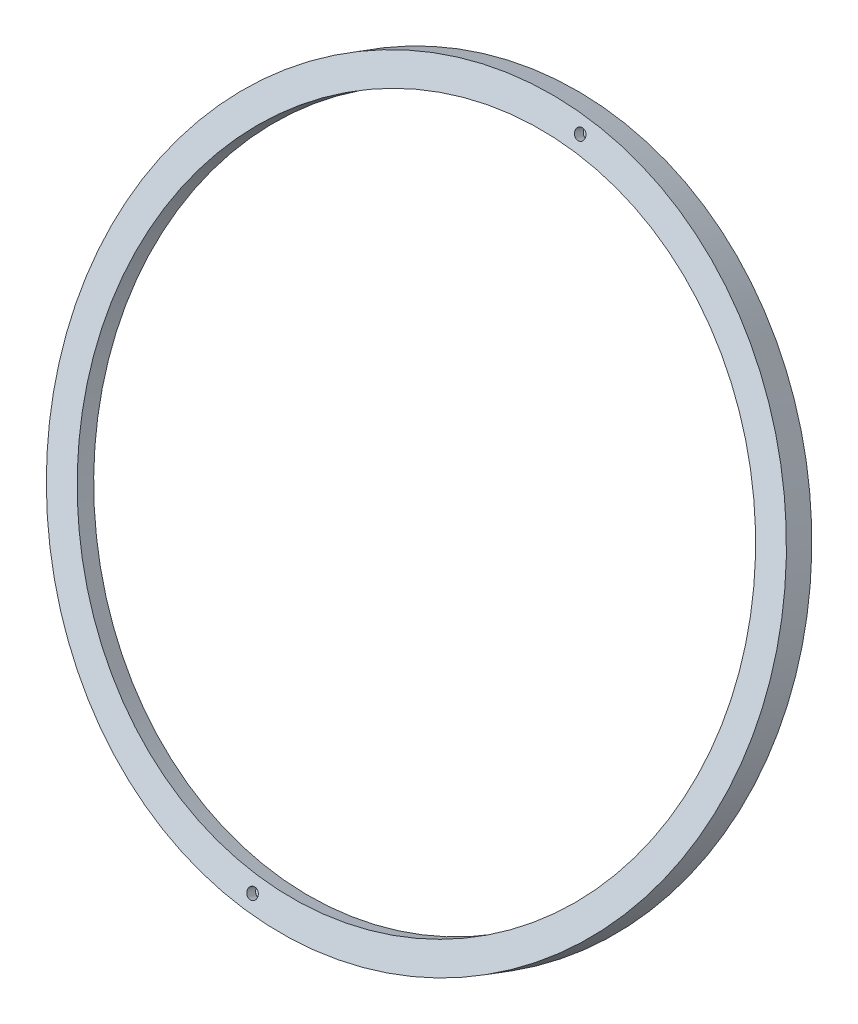
ISO-10303-21;
HEADER;
FILE_DESCRIPTION(('STEP AP214'),'2;1');
FILE_NAME('part.step','',(''),(''),'','','');
FILE_SCHEMA(('AUTOMOTIVE_DESIGN { 1 0 10303 214 1 1 1 1 }'));
ENDSEC;
DATA;
#1=APPLICATION_CONTEXT('core data for automotive mechanical design processes');
#2=APPLICATION_PROTOCOL_DEFINITION('international standard','automotive_design',2000,#1);
#3=PRODUCT_CONTEXT('',#1,'mechanical');
#4=PRODUCT('Part','Part','',(#3));
#5=PRODUCT_RELATED_PRODUCT_CATEGORY('part','',(#4));
#6=PRODUCT_DEFINITION_FORMATION('','',#4);
#7=PRODUCT_DEFINITION_CONTEXT('part definition',#1,'design');
#8=PRODUCT_DEFINITION('design','',#6,#7);
#9=PRODUCT_DEFINITION_SHAPE('','',#8);
#10=(LENGTH_UNIT() NAMED_UNIT(*) SI_UNIT(.MILLI.,.METRE.));
#11=(NAMED_UNIT(*) PLANE_ANGLE_UNIT() SI_UNIT($,.RADIAN.));
#12=(NAMED_UNIT(*) SI_UNIT($,.STERADIAN.) SOLID_ANGLE_UNIT());
#13=UNCERTAINTY_MEASURE_WITH_UNIT(LENGTH_MEASURE(1.E-05),#10,'distance_accuracy_value','');
#14=(GEOMETRIC_REPRESENTATION_CONTEXT(3) GLOBAL_UNCERTAINTY_ASSIGNED_CONTEXT((#13)) GLOBAL_UNIT_ASSIGNED_CONTEXT((#10,
#11,#12)) REPRESENTATION_CONTEXT('',''));
#15=CARTESIAN_POINT('',(0.,0.,0.));
#16=DIRECTION('',(0.,0.,1.));
#17=DIRECTION('',(1.,0.,0.));
#18=AXIS2_PLACEMENT_3D('',#15,#16,#17);
#19=CARTESIAN_POINT('',(-7.68319318863571,144.754032102574,352.33270189018));
#20=DIRECTION('',(0.0620196065672447,0.383020208529753,0.921655623461968));
#21=DIRECTION('',(0.,-0.923433296037535,0.383758970930002));
#22=AXIS2_PLACEMENT_3D('',#19,#20,#21);
#23=CYLINDRICAL_SURFACE('',#22,48.);
#24=CARTESIAN_POINT('',(-7.52195405658836,145.749811492322,354.728830485617));
#25=DIRECTION('',(0.0620196065672447,0.383020208529753,0.921655623461968));
#26=DIRECTION('',(0.,-0.923433296037535,0.383758970930002));
#27=AXIS2_PLACEMENT_3D('',#24,#25,#26);
#28=CIRCLE('',#27,48.);
#29=CARTESIAN_POINT('',(-7.52195405658836,101.42501328252,373.149261090257));
#30=VERTEX_POINT('',#29);
#31=EDGE_CURVE('E37',#30,#30,#28,.T.);
#32=ORIENTED_EDGE('',*,*,#31,.T.);
#33=EDGE_LOOP('',(#32));
#34=FACE_BOUND('',#33,.T.);
#35=CARTESIAN_POINT('',(-7.25526974834921,147.396798389,358.691949666504));
#36=DIRECTION('',(0.0620196065672447,0.383020208529753,0.921655623461968));
#37=DIRECTION('',(0.,-0.923433296037535,0.383758970930002));
#38=AXIS2_PLACEMENT_3D('',#35,#36,#37);
#39=CIRCLE('',#38,48.);
#40=CARTESIAN_POINT('',(-7.25526974834921,103.072000179198,377.112380271144));
#41=VERTEX_POINT('',#40);
#42=EDGE_CURVE('E10',#41,#41,#39,.T.);
#43=ORIENTED_EDGE('',*,*,#42,.F.);
#44=EDGE_LOOP('',(#43));
#45=FACE_BOUND('',#44,.T.);
#46=ADVANCED_FACE('F30',(#34,#45),#23,.T.);
#47=CARTESIAN_POINT('',(-7.25526974834921,147.396798389,358.691949666504));
#48=DIRECTION('',(0.0620196065672447,0.383020208529753,0.921655623461968));
#49=DIRECTION('',(0.,-0.923433296037535,0.383758970930002));
#50=AXIS2_PLACEMENT_3D('',#47,#48,#49);
#51=PLANE('',#50);
#52=CARTESIAN_POINT('',(-7.25526974834921,147.396798389,358.691949666504));
#53=DIRECTION('',(0.0620196065672447,0.383020208529753,0.921655623461968));
#54=DIRECTION('',(0.,-0.923433296037535,0.383758970930002));
#55=AXIS2_PLACEMENT_3D('',#52,#53,#54);
#56=CIRCLE('',#55,44.);
#57=CARTESIAN_POINT('',(-7.25526974834921,106.765733363348,375.577344387424));
#58=VERTEX_POINT('',#57);
#59=EDGE_CURVE('E33',#58,#58,#56,.T.);
#60=ORIENTED_EDGE('',*,*,#59,.F.);
#61=EDGE_LOOP('',(#60));
#62=FACE_BOUND('',#61,.T.);
#63=CARTESIAN_POINT('',(-13.2712098691312,105.428573351406,376.537861009358));
#64=DIRECTION('',(0.062019606567245,0.383020208529749,0.921655623461969));
#65=DIRECTION('',(0.,-0.923433296037537,0.383758970929998));
#66=AXIS2_PLACEMENT_3D('',#63,#64,#65);
#67=CIRCLE('',#66,0.750000000000008);
#68=CARTESIAN_POINT('',(-13.2712098691312,104.735998379378,376.825680237556));
#69=VERTEX_POINT('',#68);
#70=EDGE_CURVE('E49',#69,#69,#67,.T.);
#71=ORIENTED_EDGE('',*,*,#70,.F.);
#72=EDGE_LOOP('',(#71));
#73=FACE_BOUND('',#72,.T.);
#74=CARTESIAN_POINT('',(-1.23932962756717,189.365023426594,340.846038323649));
#75=DIRECTION('',(0.0620196065672448,0.383020208529755,0.921655623461967));
#76=DIRECTION('',(0.,-0.923433296037534,0.383758970930004));
#77=AXIS2_PLACEMENT_3D('',#74,#75,#76);
#78=CIRCLE('',#77,0.750000000000008);
#79=CARTESIAN_POINT('',(-1.23932962756717,188.672448454566,341.133857551846));
#80=VERTEX_POINT('',#79);
#81=EDGE_CURVE('E41',#80,#80,#78,.T.);
#82=ORIENTED_EDGE('',*,*,#81,.F.);
#83=EDGE_LOOP('',(#82));
#84=FACE_BOUND('',#83,.T.);
#85=ORIENTED_EDGE('',*,*,#42,.T.);
#86=EDGE_LOOP('',(#85));
#87=FACE_BOUND('',#86,.T.);
#88=ADVANCED_FACE('F84',(#62,#73,#84,#87),#51,.T.);
#89=CARTESIAN_POINT('',(40.3856426436894,144.607383633423,351.979823939473));
#90=DIRECTION('',(-0.0620196065672447,-0.383020208529753,-0.921655623461968));
#91=DIRECTION('',(0.,0.923433296037535,-0.383758970930002));
#92=AXIS2_PLACEMENT_3D('',#89,#90,#91);
#93=PLANE('',#92);
#94=CARTESIAN_POINT('',(-7.52195405658835,145.749811492322,354.728830485617));
#95=DIRECTION('',(-0.0620196065672448,-0.383020208529755,-0.921655623461967));
#96=DIRECTION('',(0.,0.923433296037534,-0.383758970930004));
#97=AXIS2_PLACEMENT_3D('',#94,#95,#96);
#98=CIRCLE('',#97,46.);
#99=CARTESIAN_POINT('',(-7.52195405658835,188.227743110049,337.075917822837));
#100=VERTEX_POINT('',#99);
#101=EDGE_CURVE('E55',#100,#100,#98,.T.);
#102=ORIENTED_EDGE('',*,*,#101,.F.);
#103=EDGE_LOOP('',(#102));
#104=FACE_BOUND('',#103,.T.);
#105=ORIENTED_EDGE('',*,*,#31,.F.);
#106=EDGE_LOOP('',(#105));
#107=FACE_BOUND('',#106,.T.);
#108=ADVANCED_FACE('F80',(#104,#107),#93,.T.);
#109=CARTESIAN_POINT('',(-1.23932962756717,189.365023426594,340.846038323649));
#110=DIRECTION('',(0.0620196065672448,0.383020208529755,0.921655623461967));
#111=DIRECTION('',(0.,-0.923433296037534,0.383758970930004));
#112=AXIS2_PLACEMENT_3D('',#109,#110,#111);
#113=CYLINDRICAL_SURFACE('',#112,0.750000000000007);
#114=CARTESIAN_POINT('',(-1.33235903741804,188.790493113799,339.463554888456));
#115=DIRECTION('',(0.0620196065672448,0.383020208529755,0.921655623461967));
#116=DIRECTION('',(0.,-0.923433296037534,0.383758970930004));
#117=AXIS2_PLACEMENT_3D('',#114,#115,#116);
#118=CIRCLE('',#117,0.750000000000012);
#119=CARTESIAN_POINT('',(-1.33235903741804,188.097918141771,339.751374116653));
#120=VERTEX_POINT('',#119);
#121=EDGE_CURVE('E46',#120,#120,#118,.T.);
#122=ORIENTED_EDGE('',*,*,#121,.F.);
#123=EDGE_LOOP('',(#122));
#124=FACE_BOUND('',#123,.T.);
#125=ORIENTED_EDGE('',*,*,#81,.T.);
#126=EDGE_LOOP('',(#125));
#127=FACE_BOUND('',#126,.T.);
#128=ADVANCED_FACE('F83',(#124,#127),#113,.F.);
#129=CARTESIAN_POINT('',(-1.33235903741804,188.790493113799,339.463554888456));
#130=DIRECTION('',(-0.0620196065672448,-0.383020208529755,-0.921655623461967));
#131=DIRECTION('',(0.,0.923433296037534,-0.383758970930004));
#132=AXIS2_PLACEMENT_3D('',#129,#130,#131);
#133=PLANE('',#132);
#134=ORIENTED_EDGE('',*,*,#121,.T.);
#135=EDGE_LOOP('',(#134));
#136=FACE_BOUND('',#135,.T.);
#137=ADVANCED_FACE('F101',(#136),#133,.F.);
#138=CARTESIAN_POINT('',(-13.2712098691312,105.428573351406,376.537861009358));
#139=DIRECTION('',(0.062019606567245,0.383020208529749,0.921655623461969));
#140=DIRECTION('',(0.,-0.923433296037537,0.383758970929998));
#141=AXIS2_PLACEMENT_3D('',#138,#139,#140);
#142=CYLINDRICAL_SURFACE('',#141,0.750000000000003);
#143=CARTESIAN_POINT('',(-13.3642392789821,104.854043038611,375.155377574165));
#144=DIRECTION('',(0.062019606567245,0.383020208529749,0.921655623461969));
#145=DIRECTION('',(0.,-0.923433296037537,0.383758970929998));
#146=AXIS2_PLACEMENT_3D('',#143,#144,#145);
#147=CIRCLE('',#146,0.750000000000004);
#148=CARTESIAN_POINT('',(-13.3642392789821,104.161468066583,375.443196802363));
#149=VERTEX_POINT('',#148);
#150=EDGE_CURVE('E52',#149,#149,#147,.T.);
#151=ORIENTED_EDGE('',*,*,#150,.F.);
#152=EDGE_LOOP('',(#151));
#153=FACE_BOUND('',#152,.T.);
#154=ORIENTED_EDGE('',*,*,#70,.T.);
#155=EDGE_LOOP('',(#154));
#156=FACE_BOUND('',#155,.T.);
#157=ADVANCED_FACE('F105',(#153,#156),#142,.F.);
#158=CARTESIAN_POINT('',(-13.3642392789821,104.854043038611,375.155377574165));
#159=DIRECTION('',(-0.062019606567245,-0.383020208529749,-0.921655623461969));
#160=DIRECTION('',(0.,0.923433296037537,-0.383758970929998));
#161=AXIS2_PLACEMENT_3D('',#158,#159,#160);
#162=PLANE('',#161);
#163=ORIENTED_EDGE('',*,*,#150,.T.);
#164=EDGE_LOOP('',(#163));
#165=FACE_BOUND('',#164,.T.);
#166=ADVANCED_FACE('F76',(#165),#162,.F.);
#167=CARTESIAN_POINT('',(-7.52195405658835,145.749811492322,354.728830485617));
#168=DIRECTION('',(-0.0620196065672448,-0.383020208529755,-0.921655623461967));
#169=DIRECTION('',(0.,0.923433296037534,-0.383758970930004));
#170=AXIS2_PLACEMENT_3D('',#167,#168,#169);
#171=CYLINDRICAL_SURFACE('',#170,46.);
#172=CARTESIAN_POINT('',(-7.42892464673748,146.324341805117,356.11131392081));
#173=DIRECTION('',(-0.0620196065672448,-0.383020208529755,-0.921655623461967));
#174=DIRECTION('',(0.,0.923433296037534,-0.383758970930004));
#175=AXIS2_PLACEMENT_3D('',#172,#173,#174);
#176=CIRCLE('',#175,46.);
#177=CARTESIAN_POINT('',(-7.42892464673748,188.802273422843,338.45840125803));
#178=VERTEX_POINT('',#177);
#179=EDGE_CURVE('E58',#178,#178,#176,.T.);
#180=ORIENTED_EDGE('',*,*,#179,.F.);
#181=EDGE_LOOP('',(#180));
#182=FACE_BOUND('',#181,.T.);
#183=ORIENTED_EDGE('',*,*,#101,.T.);
#184=EDGE_LOOP('',(#183));
#185=FACE_BOUND('',#184,.T.);
#186=ADVANCED_FACE('F70',(#182,#185),#171,.F.);
#187=CARTESIAN_POINT('',(22.0147781829202,175.768044634774,341.89383427927));
#188=DIRECTION('',(0.0620196065672448,0.383020208529755,0.921655623461967));
#189=DIRECTION('',(0.,-0.923433296037534,0.383758970930004));
#190=AXIS2_PLACEMENT_3D('',#187,#188,#189);
#191=PLANE('',#190);
#192=CARTESIAN_POINT('',(-7.42892464673748,146.324341805117,356.11131392081));
#193=DIRECTION('',(-0.0620196065672448,-0.383020208529755,-0.921655623461967));
#194=DIRECTION('',(0.,0.923433296037534,-0.383758970930004));
#195=AXIS2_PLACEMENT_3D('',#192,#193,#194);
#196=CIRCLE('',#195,44.);
#197=CARTESIAN_POINT('',(-7.42892464673748,186.955406830768,339.22591919989));
#198=VERTEX_POINT('',#197);
#199=EDGE_CURVE('E61',#198,#198,#196,.T.);
#200=ORIENTED_EDGE('',*,*,#199,.F.);
#201=EDGE_LOOP('',(#200));
#202=FACE_BOUND('',#201,.T.);
#203=ORIENTED_EDGE('',*,*,#179,.T.);
#204=EDGE_LOOP('',(#203));
#205=FACE_BOUND('',#204,.T.);
#206=ADVANCED_FACE('F67',(#202,#205),#191,.F.);
#207=CARTESIAN_POINT('',(-7.52195405658835,145.749811492322,354.728830485617));
#208=DIRECTION('',(-0.0620196065672448,-0.383020208529755,-0.921655623461967));
#209=DIRECTION('',(0.,0.923433296037534,-0.383758970930004));
#210=AXIS2_PLACEMENT_3D('',#207,#208,#209);
#211=CYLINDRICAL_SURFACE('',#210,44.);
#212=ORIENTED_EDGE('',*,*,#59,.T.);
#213=EDGE_LOOP('',(#212));
#214=FACE_BOUND('',#213,.T.);
#215=ORIENTED_EDGE('',*,*,#199,.T.);
#216=EDGE_LOOP('',(#215));
#217=FACE_BOUND('',#216,.T.);
#218=ADVANCED_FACE('F65',(#214,#217),#211,.F.);
#219=CLOSED_SHELL('',(#46,#88,#108,#128,#137,#157,#166,#186,#206,#218));
#220=MANIFOLD_SOLID_BREP('B2',#219);
#221=ADVANCED_BREP_SHAPE_REPRESENTATION('',(#18,#220),#14);
#222=SHAPE_DEFINITION_REPRESENTATION(#9,#221);
ENDSEC;
END-ISO-10303-21;
